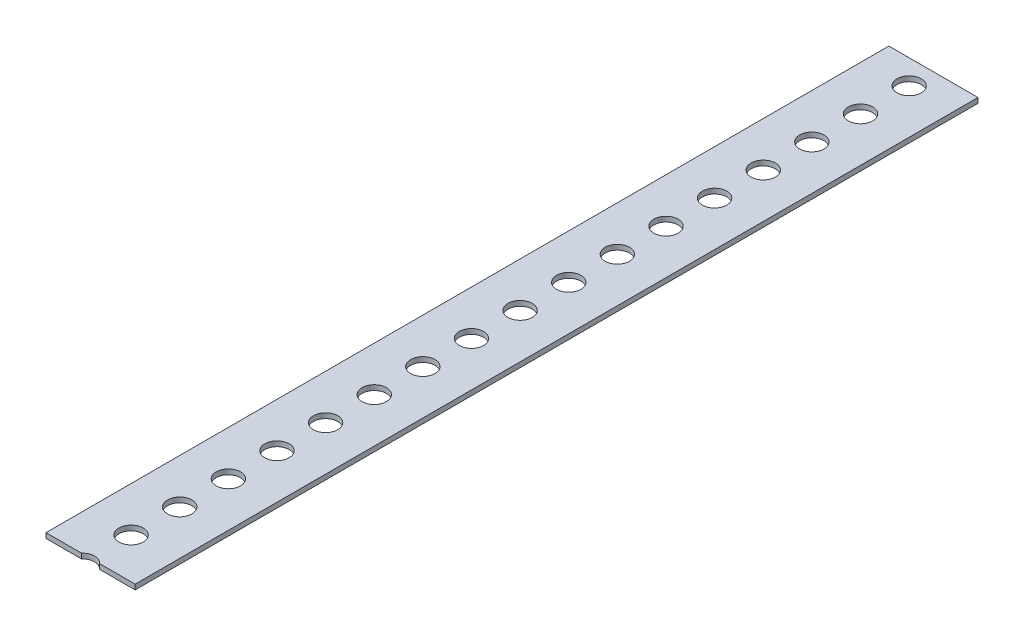
ISO-10303-21;
HEADER;
FILE_DESCRIPTION(('STEP AP214'),'2;1');
FILE_NAME('part.step','',(''),(''),'','','');
FILE_SCHEMA(('AUTOMOTIVE_DESIGN { 1 0 10303 214 1 1 1 1 }'));
ENDSEC;
DATA;
#1=APPLICATION_CONTEXT('core data for automotive mechanical design processes');
#2=APPLICATION_PROTOCOL_DEFINITION('international standard','automotive_design',2000,#1);
#3=PRODUCT_CONTEXT('',#1,'mechanical');
#4=PRODUCT('Part','Part','',(#3));
#5=PRODUCT_RELATED_PRODUCT_CATEGORY('part','',(#4));
#6=PRODUCT_DEFINITION_FORMATION('','',#4);
#7=PRODUCT_DEFINITION_CONTEXT('part definition',#1,'design');
#8=PRODUCT_DEFINITION('design','',#6,#7);
#9=PRODUCT_DEFINITION_SHAPE('','',#8);
#10=(LENGTH_UNIT() NAMED_UNIT(*) SI_UNIT(.MILLI.,.METRE.));
#11=(NAMED_UNIT(*) PLANE_ANGLE_UNIT() SI_UNIT($,.RADIAN.));
#12=(NAMED_UNIT(*) SI_UNIT($,.STERADIAN.) SOLID_ANGLE_UNIT());
#13=UNCERTAINTY_MEASURE_WITH_UNIT(LENGTH_MEASURE(1.E-05),#10,'distance_accuracy_value','');
#14=(GEOMETRIC_REPRESENTATION_CONTEXT(3) GLOBAL_UNCERTAINTY_ASSIGNED_CONTEXT((#13)) GLOBAL_UNIT_ASSIGNED_CONTEXT((#10,
#11,#12)) REPRESENTATION_CONTEXT('',''));
#15=CARTESIAN_POINT('',(0.,0.,0.));
#16=DIRECTION('',(0.,0.,1.));
#17=DIRECTION('',(1.,0.,0.));
#18=AXIS2_PLACEMENT_3D('',#15,#16,#17);
#19=CARTESIAN_POINT('',(-17.4624999999999,-0.99187,-457.199999999999));
#20=DIRECTION('',(-1.,0.,0.));
#21=DIRECTION('',(0.,0.,1.));
#22=AXIS2_PLACEMENT_3D('',#19,#20,#21);
#23=PLANE('',#22);
#24=DIRECTION('',(0.,-1.,0.));
#25=VECTOR('',#24,1.);
#26=CARTESIAN_POINT('',(-17.4625,-0.99187,-126.999999999999));
#27=LINE('',#26,#25);
#28=CARTESIAN_POINT('',(-17.4625,0.99187,-126.999999999999));
#29=VERTEX_POINT('',#28);
#30=CARTESIAN_POINT('',(-17.4625,-0.99187,-126.999999999999));
#31=VERTEX_POINT('',#30);
#32=EDGE_CURVE('E89',#29,#31,#27,.T.);
#33=ORIENTED_EDGE('',*,*,#32,.F.);
#34=DIRECTION('',(0.,0.,1.));
#35=VECTOR('',#34,1.);
#36=CARTESIAN_POINT('',(-17.4624999999999,0.99187,-457.199999999999));
#37=LINE('',#36,#35);
#38=CARTESIAN_POINT('',(-17.4624999999999,0.99187,-457.199999999999));
#39=VERTEX_POINT('',#38);
#40=EDGE_CURVE('E151',#39,#29,#37,.T.);
#41=ORIENTED_EDGE('',*,*,#40,.F.);
#42=DIRECTION('',(0.,1.,0.));
#43=VECTOR('',#42,1.);
#44=CARTESIAN_POINT('',(-17.4624999999999,-0.99187,-457.199999999999));
#45=LINE('',#44,#43);
#46=CARTESIAN_POINT('',(-17.4624999999999,-0.99187,-457.199999999999));
#47=VERTEX_POINT('',#46);
#48=EDGE_CURVE('E115',#47,#39,#45,.T.);
#49=ORIENTED_EDGE('',*,*,#48,.F.);
#50=DIRECTION('',(0.,0.,1.));
#51=VECTOR('',#50,1.);
#52=CARTESIAN_POINT('',(-17.4624999999999,-0.99187,-457.199999999999));
#53=LINE('',#52,#51);
#54=EDGE_CURVE('E107',#47,#31,#53,.T.);
#55=ORIENTED_EDGE('',*,*,#54,.T.);
#56=EDGE_LOOP('',(#33,#41,#49,#55));
#57=FACE_BOUND('',#56,.T.);
#58=ADVANCED_FACE('F39',(#57),#23,.T.);
#59=CARTESIAN_POINT('',(-17.4624999999999,-0.99187,-457.199999999999));
#60=DIRECTION('',(0.,0.,-1.));
#61=DIRECTION('',(-1.,0.,0.));
#62=AXIS2_PLACEMENT_3D('',#59,#60,#61);
#63=PLANE('',#62);
#64=ORIENTED_EDGE('',*,*,#48,.T.);
#65=DIRECTION('',(-1.,0.,0.));
#66=VECTOR('',#65,1.);
#67=CARTESIAN_POINT('',(-17.4624999999999,0.99187,-457.199999999999));
#68=LINE('',#67,#66);
#69=CARTESIAN_POINT('',(17.4624999999999,0.99187,-457.199999999999));
#70=VERTEX_POINT('',#69);
#71=EDGE_CURVE('E118',#70,#39,#68,.T.);
#72=ORIENTED_EDGE('',*,*,#71,.F.);
#73=DIRECTION('',(0.,1.,0.));
#74=VECTOR('',#73,1.);
#75=CARTESIAN_POINT('',(17.4624999999999,-0.99187,-457.199999999999));
#76=LINE('',#75,#74);
#77=CARTESIAN_POINT('',(17.4624999999999,-0.99187,-457.199999999999));
#78=VERTEX_POINT('',#77);
#79=EDGE_CURVE('E131',#78,#70,#76,.T.);
#80=ORIENTED_EDGE('',*,*,#79,.F.);
#81=DIRECTION('',(-1.,0.,0.));
#82=VECTOR('',#81,1.);
#83=CARTESIAN_POINT('',(-17.4624999999999,-0.99187,-457.199999999999));
#84=LINE('',#83,#82);
#85=EDGE_CURVE('E122',#78,#47,#84,.T.);
#86=ORIENTED_EDGE('',*,*,#85,.T.);
#87=EDGE_LOOP('',(#64,#72,#80,#86));
#88=FACE_BOUND('',#87,.T.);
#89=ADVANCED_FACE('F298',(#88),#63,.T.);
#90=CARTESIAN_POINT('',(17.4624999999999,-0.99187,-457.199999999999));
#91=DIRECTION('',(1.,0.,0.));
#92=DIRECTION('',(0.,0.,-1.));
#93=AXIS2_PLACEMENT_3D('',#90,#91,#92);
#94=PLANE('',#93);
#95=DIRECTION('',(0.,1.,0.));
#96=VECTOR('',#95,1.);
#97=CARTESIAN_POINT('',(17.4625,-0.99187,-126.999999999999));
#98=LINE('',#97,#96);
#99=CARTESIAN_POINT('',(17.4625,-0.99187,-126.999999999999));
#100=VERTEX_POINT('',#99);
#101=CARTESIAN_POINT('',(17.4625,0.99187,-126.999999999999));
#102=VERTEX_POINT('',#101);
#103=EDGE_CURVE('E113',#100,#102,#98,.T.);
#104=ORIENTED_EDGE('',*,*,#103,.F.);
#105=DIRECTION('',(0.,0.,-1.));
#106=VECTOR('',#105,1.);
#107=CARTESIAN_POINT('',(17.4624999999999,-0.99187,-457.199999999999));
#108=LINE('',#107,#106);
#109=EDGE_CURVE('E117',#100,#78,#108,.T.);
#110=ORIENTED_EDGE('',*,*,#109,.T.);
#111=ORIENTED_EDGE('',*,*,#79,.T.);
#112=DIRECTION('',(0.,0.,-1.));
#113=VECTOR('',#112,1.);
#114=CARTESIAN_POINT('',(17.4624999999999,0.99187,-457.199999999999));
#115=LINE('',#114,#113);
#116=EDGE_CURVE('E125',#102,#70,#115,.T.);
#117=ORIENTED_EDGE('',*,*,#116,.F.);
#118=EDGE_LOOP('',(#104,#110,#111,#117));
#119=FACE_BOUND('',#118,.T.);
#120=ADVANCED_FACE('F296',(#119),#94,.T.);
#121=CARTESIAN_POINT('',(0.,-0.99187,0.));
#122=DIRECTION('',(0.,1.,0.));
#123=DIRECTION('',(0.,0.,1.));
#124=AXIS2_PLACEMENT_3D('',#121,#122,#123);
#125=PLANE('',#124);
#126=ORIENTED_EDGE('',*,*,#109,.F.);
#127=DIRECTION('',(1.,0.,0.));
#128=VECTOR('',#127,1.);
#129=CARTESIAN_POINT('',(-17.4625,-0.99187,-126.999999999999));
#130=LINE('',#129,#128);
#131=CARTESIAN_POINT('',(3.54975791428115,-0.99187,-126.999999999999));
#132=VERTEX_POINT('',#131);
#133=EDGE_CURVE('E98',#132,#100,#130,.T.);
#134=ORIENTED_EDGE('',*,*,#133,.F.);
#135=CARTESIAN_POINT('',(0.,-0.99187,-123.824999999999));
#136=DIRECTION('',(0.,1.,0.));
#137=DIRECTION('',(0.,0.,1.));
#138=AXIS2_PLACEMENT_3D('',#135,#136,#137);
#139=CIRCLE('',#138,4.76250000000013);
#140=CARTESIAN_POINT('',(-3.54975791428115,-0.99187,-126.999999999999));
#141=VERTEX_POINT('',#140);
#142=EDGE_CURVE('E111',#141,#132,#139,.F.);
#143=ORIENTED_EDGE('',*,*,#142,.F.);
#144=EDGE_CURVE('E54',#31,#141,#130,.T.);
#145=ORIENTED_EDGE('',*,*,#144,.F.);
#146=ORIENTED_EDGE('',*,*,#54,.F.);
#147=ORIENTED_EDGE('',*,*,#85,.F.);
#148=EDGE_LOOP('',(#126,#134,#143,#145,#146,#147));
#149=FACE_BOUND('',#148,.T.);
#150=CARTESIAN_POINT('',(0.,-0.99187,-142.874999999999));
#151=DIRECTION('',(0.,1.,0.));
#152=DIRECTION('',(0.,0.,1.));
#153=AXIS2_PLACEMENT_3D('',#150,#151,#152);
#154=CIRCLE('',#153,4.76250000000013);
#155=CARTESIAN_POINT('',(0.,-0.99187,-138.112499999999));
#156=VERTEX_POINT('',#155);
#157=EDGE_CURVE('E147',#156,#156,#154,.F.);
#158=ORIENTED_EDGE('',*,*,#157,.F.);
#159=EDGE_LOOP('',(#158));
#160=FACE_BOUND('',#159,.T.);
#161=CARTESIAN_POINT('',(0.,-0.99187,-161.924999999999));
#162=DIRECTION('',(0.,1.,0.));
#163=DIRECTION('',(0.,0.,1.));
#164=AXIS2_PLACEMENT_3D('',#161,#162,#163);
#165=CIRCLE('',#164,4.76250000000013);
#166=CARTESIAN_POINT('',(0.,-0.99187,-157.162499999999));
#167=VERTEX_POINT('',#166);
#168=EDGE_CURVE('E161',#167,#167,#165,.F.);
#169=ORIENTED_EDGE('',*,*,#168,.F.);
#170=EDGE_LOOP('',(#169));
#171=FACE_BOUND('',#170,.T.);
#172=CARTESIAN_POINT('',(0.,-0.99187,-180.974999999999));
#173=DIRECTION('',(0.,1.,0.));
#174=DIRECTION('',(0.,0.,1.));
#175=AXIS2_PLACEMENT_3D('',#172,#173,#174);
#176=CIRCLE('',#175,4.76250000000013);
#177=CARTESIAN_POINT('',(0.,-0.99187,-176.212499999999));
#178=VERTEX_POINT('',#177);
#179=EDGE_CURVE('E167',#178,#178,#176,.F.);
#180=ORIENTED_EDGE('',*,*,#179,.F.);
#181=EDGE_LOOP('',(#180));
#182=FACE_BOUND('',#181,.T.);
#183=CARTESIAN_POINT('',(0.,-0.99187,-200.024999999999));
#184=DIRECTION('',(0.,1.,0.));
#185=DIRECTION('',(0.,0.,1.));
#186=AXIS2_PLACEMENT_3D('',#183,#184,#185);
#187=CIRCLE('',#186,4.76250000000013);
#188=CARTESIAN_POINT('',(0.,-0.99187,-195.262499999999));
#189=VERTEX_POINT('',#188);
#190=EDGE_CURVE('E175',#189,#189,#187,.F.);
#191=ORIENTED_EDGE('',*,*,#190,.F.);
#192=EDGE_LOOP('',(#191));
#193=FACE_BOUND('',#192,.T.);
#194=CARTESIAN_POINT('',(0.,-0.99187,-219.074999999999));
#195=DIRECTION('',(0.,1.,0.));
#196=DIRECTION('',(0.,0.,1.));
#197=AXIS2_PLACEMENT_3D('',#194,#195,#196);
#198=CIRCLE('',#197,4.76250000000013);
#199=CARTESIAN_POINT('',(0.,-0.99187,-214.312499999999));
#200=VERTEX_POINT('',#199);
#201=EDGE_CURVE('E183',#200,#200,#198,.F.);
#202=ORIENTED_EDGE('',*,*,#201,.F.);
#203=EDGE_LOOP('',(#202));
#204=FACE_BOUND('',#203,.T.);
#205=CARTESIAN_POINT('',(0.,-0.99187,-238.124999999999));
#206=DIRECTION('',(0.,1.,0.));
#207=DIRECTION('',(0.,0.,1.));
#208=AXIS2_PLACEMENT_3D('',#205,#206,#207);
#209=CIRCLE('',#208,4.76250000000013);
#210=CARTESIAN_POINT('',(0.,-0.99187,-233.362499999999));
#211=VERTEX_POINT('',#210);
#212=EDGE_CURVE('E191',#211,#211,#209,.F.);
#213=ORIENTED_EDGE('',*,*,#212,.F.);
#214=EDGE_LOOP('',(#213));
#215=FACE_BOUND('',#214,.T.);
#216=CARTESIAN_POINT('',(0.,-0.99187,-257.174999999999));
#217=DIRECTION('',(0.,1.,0.));
#218=DIRECTION('',(0.,0.,1.));
#219=AXIS2_PLACEMENT_3D('',#216,#217,#218);
#220=CIRCLE('',#219,4.76250000000013);
#221=CARTESIAN_POINT('',(0.,-0.99187,-252.412499999999));
#222=VERTEX_POINT('',#221);
#223=EDGE_CURVE('E199',#222,#222,#220,.F.);
#224=ORIENTED_EDGE('',*,*,#223,.F.);
#225=EDGE_LOOP('',(#224));
#226=FACE_BOUND('',#225,.T.);
#227=CARTESIAN_POINT('',(0.,-0.99187,-276.224999999999));
#228=DIRECTION('',(0.,1.,0.));
#229=DIRECTION('',(0.,0.,1.));
#230=AXIS2_PLACEMENT_3D('',#227,#228,#229);
#231=CIRCLE('',#230,4.76250000000013);
#232=CARTESIAN_POINT('',(0.,-0.99187,-271.462499999999));
#233=VERTEX_POINT('',#232);
#234=EDGE_CURVE('E207',#233,#233,#231,.F.);
#235=ORIENTED_EDGE('',*,*,#234,.F.);
#236=EDGE_LOOP('',(#235));
#237=FACE_BOUND('',#236,.T.);
#238=CARTESIAN_POINT('',(0.,-0.99187,-295.274999999999));
#239=DIRECTION('',(0.,1.,0.));
#240=DIRECTION('',(0.,0.,1.));
#241=AXIS2_PLACEMENT_3D('',#238,#239,#240);
#242=CIRCLE('',#241,4.76250000000013);
#243=CARTESIAN_POINT('',(0.,-0.99187,-290.512499999999));
#244=VERTEX_POINT('',#243);
#245=EDGE_CURVE('E215',#244,#244,#242,.F.);
#246=ORIENTED_EDGE('',*,*,#245,.F.);
#247=EDGE_LOOP('',(#246));
#248=FACE_BOUND('',#247,.T.);
#249=CARTESIAN_POINT('',(0.,-0.99187,-314.324999999999));
#250=DIRECTION('',(0.,1.,0.));
#251=DIRECTION('',(0.,0.,1.));
#252=AXIS2_PLACEMENT_3D('',#249,#250,#251);
#253=CIRCLE('',#252,4.76250000000013);
#254=CARTESIAN_POINT('',(0.,-0.99187,-309.562499999999));
#255=VERTEX_POINT('',#254);
#256=EDGE_CURVE('E223',#255,#255,#253,.F.);
#257=ORIENTED_EDGE('',*,*,#256,.F.);
#258=EDGE_LOOP('',(#257));
#259=FACE_BOUND('',#258,.T.);
#260=CARTESIAN_POINT('',(0.,-0.99187,-333.374999999999));
#261=DIRECTION('',(0.,1.,0.));
#262=DIRECTION('',(0.,0.,1.));
#263=AXIS2_PLACEMENT_3D('',#260,#261,#262);
#264=CIRCLE('',#263,4.76250000000013);
#265=CARTESIAN_POINT('',(0.,-0.99187,-328.612499999999));
#266=VERTEX_POINT('',#265);
#267=EDGE_CURVE('E231',#266,#266,#264,.F.);
#268=ORIENTED_EDGE('',*,*,#267,.F.);
#269=EDGE_LOOP('',(#268));
#270=FACE_BOUND('',#269,.T.);
#271=CARTESIAN_POINT('',(0.,-0.99187,-352.424999999999));
#272=DIRECTION('',(0.,1.,0.));
#273=DIRECTION('',(0.,0.,1.));
#274=AXIS2_PLACEMENT_3D('',#271,#272,#273);
#275=CIRCLE('',#274,4.76250000000013);
#276=CARTESIAN_POINT('',(0.,-0.99187,-347.662499999999));
#277=VERTEX_POINT('',#276);
#278=EDGE_CURVE('E239',#277,#277,#275,.F.);
#279=ORIENTED_EDGE('',*,*,#278,.F.);
#280=EDGE_LOOP('',(#279));
#281=FACE_BOUND('',#280,.T.);
#282=CARTESIAN_POINT('',(0.,-0.99187,-371.474999999999));
#283=DIRECTION('',(0.,1.,0.));
#284=DIRECTION('',(0.,0.,1.));
#285=AXIS2_PLACEMENT_3D('',#282,#283,#284);
#286=CIRCLE('',#285,4.76250000000013);
#287=CARTESIAN_POINT('',(0.,-0.99187,-366.712499999999));
#288=VERTEX_POINT('',#287);
#289=EDGE_CURVE('E247',#288,#288,#286,.F.);
#290=ORIENTED_EDGE('',*,*,#289,.F.);
#291=EDGE_LOOP('',(#290));
#292=FACE_BOUND('',#291,.T.);
#293=CARTESIAN_POINT('',(0.,-0.99187,-390.524999999999));
#294=DIRECTION('',(0.,1.,0.));
#295=DIRECTION('',(0.,0.,1.));
#296=AXIS2_PLACEMENT_3D('',#293,#294,#295);
#297=CIRCLE('',#296,4.76250000000013);
#298=CARTESIAN_POINT('',(0.,-0.99187,-385.762499999999));
#299=VERTEX_POINT('',#298);
#300=EDGE_CURVE('E255',#299,#299,#297,.F.);
#301=ORIENTED_EDGE('',*,*,#300,.F.);
#302=EDGE_LOOP('',(#301));
#303=FACE_BOUND('',#302,.T.);
#304=CARTESIAN_POINT('',(0.,-0.99187,-409.574999999999));
#305=DIRECTION('',(0.,1.,0.));
#306=DIRECTION('',(0.,0.,1.));
#307=AXIS2_PLACEMENT_3D('',#304,#305,#306);
#308=CIRCLE('',#307,4.76250000000013);
#309=CARTESIAN_POINT('',(0.,-0.99187,-404.812499999999));
#310=VERTEX_POINT('',#309);
#311=EDGE_CURVE('E263',#310,#310,#308,.F.);
#312=ORIENTED_EDGE('',*,*,#311,.F.);
#313=EDGE_LOOP('',(#312));
#314=FACE_BOUND('',#313,.T.);
#315=CARTESIAN_POINT('',(0.,-0.99187,-428.624999999999));
#316=DIRECTION('',(0.,1.,0.));
#317=DIRECTION('',(0.,0.,1.));
#318=AXIS2_PLACEMENT_3D('',#315,#316,#317);
#319=CIRCLE('',#318,4.76250000000013);
#320=CARTESIAN_POINT('',(0.,-0.99187,-423.862499999999));
#321=VERTEX_POINT('',#320);
#322=EDGE_CURVE('E271',#321,#321,#319,.F.);
#323=ORIENTED_EDGE('',*,*,#322,.F.);
#324=EDGE_LOOP('',(#323));
#325=FACE_BOUND('',#324,.T.);
#326=CARTESIAN_POINT('',(0.,-0.99187,-447.674999999999));
#327=DIRECTION('',(0.,1.,0.));
#328=DIRECTION('',(0.,0.,1.));
#329=AXIS2_PLACEMENT_3D('',#326,#327,#328);
#330=CIRCLE('',#329,4.76250000000013);
#331=CARTESIAN_POINT('',(0.,-0.99187,-442.912499999999));
#332=VERTEX_POINT('',#331);
#333=EDGE_CURVE('E279',#332,#332,#330,.F.);
#334=ORIENTED_EDGE('',*,*,#333,.F.);
#335=EDGE_LOOP('',(#334));
#336=FACE_BOUND('',#335,.T.);
#337=ADVANCED_FACE('F104',(#149,#160,#171,#182,#193,#204,#215,#226,#237,#248,#259,#270,#281,
#292,#303,#314,#325,#336),#125,.F.);
#338=CARTESIAN_POINT('',(0.,0.99187,0.));
#339=DIRECTION('',(0.,1.,0.));
#340=DIRECTION('',(0.,0.,1.));
#341=AXIS2_PLACEMENT_3D('',#338,#339,#340);
#342=PLANE('',#341);
#343=DIRECTION('',(-1.,0.,0.));
#344=VECTOR('',#343,1.);
#345=CARTESIAN_POINT('',(-17.4625,0.99187,-126.999999999999));
#346=LINE('',#345,#344);
#347=CARTESIAN_POINT('',(3.54975791428115,0.99187,-126.999999999999));
#348=VERTEX_POINT('',#347);
#349=EDGE_CURVE('E61',#102,#348,#346,.T.);
#350=ORIENTED_EDGE('',*,*,#349,.F.);
#351=ORIENTED_EDGE('',*,*,#116,.T.);
#352=ORIENTED_EDGE('',*,*,#71,.T.);
#353=ORIENTED_EDGE('',*,*,#40,.T.);
#354=CARTESIAN_POINT('',(-3.54975791428115,0.99187,-126.999999999999));
#355=VERTEX_POINT('',#354);
#356=EDGE_CURVE('E92',#355,#29,#346,.T.);
#357=ORIENTED_EDGE('',*,*,#356,.F.);
#358=CARTESIAN_POINT('',(0.,0.99187,-123.824999999999));
#359=DIRECTION('',(0.,1.,0.));
#360=DIRECTION('',(0.,0.,1.));
#361=AXIS2_PLACEMENT_3D('',#358,#359,#360);
#362=CIRCLE('',#361,4.76250000000013);
#363=EDGE_CURVE('E141',#348,#355,#362,.T.);
#364=ORIENTED_EDGE('',*,*,#363,.F.);
#365=EDGE_LOOP('',(#350,#351,#352,#353,#357,#364));
#366=FACE_BOUND('',#365,.T.);
#367=CARTESIAN_POINT('',(0.,0.99187,-142.874999999999));
#368=DIRECTION('',(0.,1.,0.));
#369=DIRECTION('',(0.,0.,1.));
#370=AXIS2_PLACEMENT_3D('',#367,#368,#369);
#371=CIRCLE('',#370,4.76250000000013);
#372=CARTESIAN_POINT('',(0.,0.99187,-138.112499999999));
#373=VERTEX_POINT('',#372);
#374=EDGE_CURVE('E154',#373,#373,#371,.T.);
#375=ORIENTED_EDGE('',*,*,#374,.F.);
#376=EDGE_LOOP('',(#375));
#377=FACE_BOUND('',#376,.T.);
#378=CARTESIAN_POINT('',(0.,0.99187,-161.924999999999));
#379=DIRECTION('',(0.,1.,0.));
#380=DIRECTION('',(0.,0.,1.));
#381=AXIS2_PLACEMENT_3D('',#378,#379,#380);
#382=CIRCLE('',#381,4.76250000000013);
#383=CARTESIAN_POINT('',(0.,0.99187,-157.162499999999));
#384=VERTEX_POINT('',#383);
#385=EDGE_CURVE('E163',#384,#384,#382,.T.);
#386=ORIENTED_EDGE('',*,*,#385,.F.);
#387=EDGE_LOOP('',(#386));
#388=FACE_BOUND('',#387,.T.);
#389=CARTESIAN_POINT('',(0.,0.99187,-180.974999999999));
#390=DIRECTION('',(0.,1.,0.));
#391=DIRECTION('',(0.,0.,1.));
#392=AXIS2_PLACEMENT_3D('',#389,#390,#391);
#393=CIRCLE('',#392,4.76250000000013);
#394=CARTESIAN_POINT('',(0.,0.99187,-176.212499999999));
#395=VERTEX_POINT('',#394);
#396=EDGE_CURVE('E171',#395,#395,#393,.T.);
#397=ORIENTED_EDGE('',*,*,#396,.F.);
#398=EDGE_LOOP('',(#397));
#399=FACE_BOUND('',#398,.T.);
#400=CARTESIAN_POINT('',(0.,0.99187,-200.024999999999));
#401=DIRECTION('',(0.,1.,0.));
#402=DIRECTION('',(0.,0.,1.));
#403=AXIS2_PLACEMENT_3D('',#400,#401,#402);
#404=CIRCLE('',#403,4.76250000000013);
#405=CARTESIAN_POINT('',(0.,0.99187,-195.262499999999));
#406=VERTEX_POINT('',#405);
#407=EDGE_CURVE('E179',#406,#406,#404,.T.);
#408=ORIENTED_EDGE('',*,*,#407,.F.);
#409=EDGE_LOOP('',(#408));
#410=FACE_BOUND('',#409,.T.);
#411=CARTESIAN_POINT('',(0.,0.99187,-219.074999999999));
#412=DIRECTION('',(0.,1.,0.));
#413=DIRECTION('',(0.,0.,1.));
#414=AXIS2_PLACEMENT_3D('',#411,#412,#413);
#415=CIRCLE('',#414,4.76250000000013);
#416=CARTESIAN_POINT('',(0.,0.99187,-214.312499999999));
#417=VERTEX_POINT('',#416);
#418=EDGE_CURVE('E187',#417,#417,#415,.T.);
#419=ORIENTED_EDGE('',*,*,#418,.F.);
#420=EDGE_LOOP('',(#419));
#421=FACE_BOUND('',#420,.T.);
#422=CARTESIAN_POINT('',(0.,0.99187,-238.124999999999));
#423=DIRECTION('',(0.,1.,0.));
#424=DIRECTION('',(0.,0.,1.));
#425=AXIS2_PLACEMENT_3D('',#422,#423,#424);
#426=CIRCLE('',#425,4.76250000000013);
#427=CARTESIAN_POINT('',(0.,0.99187,-233.362499999999));
#428=VERTEX_POINT('',#427);
#429=EDGE_CURVE('E195',#428,#428,#426,.T.);
#430=ORIENTED_EDGE('',*,*,#429,.F.);
#431=EDGE_LOOP('',(#430));
#432=FACE_BOUND('',#431,.T.);
#433=CARTESIAN_POINT('',(0.,0.99187,-257.174999999999));
#434=DIRECTION('',(0.,1.,0.));
#435=DIRECTION('',(0.,0.,1.));
#436=AXIS2_PLACEMENT_3D('',#433,#434,#435);
#437=CIRCLE('',#436,4.76250000000013);
#438=CARTESIAN_POINT('',(0.,0.99187,-252.412499999999));
#439=VERTEX_POINT('',#438);
#440=EDGE_CURVE('E203',#439,#439,#437,.T.);
#441=ORIENTED_EDGE('',*,*,#440,.F.);
#442=EDGE_LOOP('',(#441));
#443=FACE_BOUND('',#442,.T.);
#444=CARTESIAN_POINT('',(0.,0.99187,-276.224999999999));
#445=DIRECTION('',(0.,1.,0.));
#446=DIRECTION('',(0.,0.,1.));
#447=AXIS2_PLACEMENT_3D('',#444,#445,#446);
#448=CIRCLE('',#447,4.76250000000013);
#449=CARTESIAN_POINT('',(0.,0.99187,-271.462499999999));
#450=VERTEX_POINT('',#449);
#451=EDGE_CURVE('E211',#450,#450,#448,.T.);
#452=ORIENTED_EDGE('',*,*,#451,.F.);
#453=EDGE_LOOP('',(#452));
#454=FACE_BOUND('',#453,.T.);
#455=CARTESIAN_POINT('',(0.,0.99187,-295.274999999999));
#456=DIRECTION('',(0.,1.,0.));
#457=DIRECTION('',(0.,0.,1.));
#458=AXIS2_PLACEMENT_3D('',#455,#456,#457);
#459=CIRCLE('',#458,4.76250000000013);
#460=CARTESIAN_POINT('',(0.,0.99187,-290.512499999999));
#461=VERTEX_POINT('',#460);
#462=EDGE_CURVE('E219',#461,#461,#459,.T.);
#463=ORIENTED_EDGE('',*,*,#462,.F.);
#464=EDGE_LOOP('',(#463));
#465=FACE_BOUND('',#464,.T.);
#466=CARTESIAN_POINT('',(0.,0.99187,-314.324999999999));
#467=DIRECTION('',(0.,1.,0.));
#468=DIRECTION('',(0.,0.,1.));
#469=AXIS2_PLACEMENT_3D('',#466,#467,#468);
#470=CIRCLE('',#469,4.76250000000013);
#471=CARTESIAN_POINT('',(0.,0.99187,-309.562499999999));
#472=VERTEX_POINT('',#471);
#473=EDGE_CURVE('E227',#472,#472,#470,.T.);
#474=ORIENTED_EDGE('',*,*,#473,.F.);
#475=EDGE_LOOP('',(#474));
#476=FACE_BOUND('',#475,.T.);
#477=CARTESIAN_POINT('',(0.,0.99187,-333.374999999999));
#478=DIRECTION('',(0.,1.,0.));
#479=DIRECTION('',(0.,0.,1.));
#480=AXIS2_PLACEMENT_3D('',#477,#478,#479);
#481=CIRCLE('',#480,4.76250000000013);
#482=CARTESIAN_POINT('',(0.,0.99187,-328.612499999999));
#483=VERTEX_POINT('',#482);
#484=EDGE_CURVE('E235',#483,#483,#481,.T.);
#485=ORIENTED_EDGE('',*,*,#484,.F.);
#486=EDGE_LOOP('',(#485));
#487=FACE_BOUND('',#486,.T.);
#488=CARTESIAN_POINT('',(0.,0.99187,-352.424999999999));
#489=DIRECTION('',(0.,1.,0.));
#490=DIRECTION('',(0.,0.,1.));
#491=AXIS2_PLACEMENT_3D('',#488,#489,#490);
#492=CIRCLE('',#491,4.76250000000013);
#493=CARTESIAN_POINT('',(0.,0.99187,-347.662499999999));
#494=VERTEX_POINT('',#493);
#495=EDGE_CURVE('E243',#494,#494,#492,.T.);
#496=ORIENTED_EDGE('',*,*,#495,.F.);
#497=EDGE_LOOP('',(#496));
#498=FACE_BOUND('',#497,.T.);
#499=CARTESIAN_POINT('',(0.,0.99187,-371.474999999999));
#500=DIRECTION('',(0.,1.,0.));
#501=DIRECTION('',(0.,0.,1.));
#502=AXIS2_PLACEMENT_3D('',#499,#500,#501);
#503=CIRCLE('',#502,4.76250000000013);
#504=CARTESIAN_POINT('',(0.,0.99187,-366.712499999999));
#505=VERTEX_POINT('',#504);
#506=EDGE_CURVE('E251',#505,#505,#503,.T.);
#507=ORIENTED_EDGE('',*,*,#506,.F.);
#508=EDGE_LOOP('',(#507));
#509=FACE_BOUND('',#508,.T.);
#510=CARTESIAN_POINT('',(0.,0.99187,-390.524999999999));
#511=DIRECTION('',(0.,1.,0.));
#512=DIRECTION('',(0.,0.,1.));
#513=AXIS2_PLACEMENT_3D('',#510,#511,#512);
#514=CIRCLE('',#513,4.76250000000013);
#515=CARTESIAN_POINT('',(0.,0.99187,-385.762499999999));
#516=VERTEX_POINT('',#515);
#517=EDGE_CURVE('E259',#516,#516,#514,.T.);
#518=ORIENTED_EDGE('',*,*,#517,.F.);
#519=EDGE_LOOP('',(#518));
#520=FACE_BOUND('',#519,.T.);
#521=CARTESIAN_POINT('',(0.,0.99187,-409.574999999999));
#522=DIRECTION('',(0.,1.,0.));
#523=DIRECTION('',(0.,0.,1.));
#524=AXIS2_PLACEMENT_3D('',#521,#522,#523);
#525=CIRCLE('',#524,4.76250000000013);
#526=CARTESIAN_POINT('',(0.,0.99187,-404.812499999999));
#527=VERTEX_POINT('',#526);
#528=EDGE_CURVE('E267',#527,#527,#525,.T.);
#529=ORIENTED_EDGE('',*,*,#528,.F.);
#530=EDGE_LOOP('',(#529));
#531=FACE_BOUND('',#530,.T.);
#532=CARTESIAN_POINT('',(0.,0.99187,-428.624999999999));
#533=DIRECTION('',(0.,1.,0.));
#534=DIRECTION('',(0.,0.,1.));
#535=AXIS2_PLACEMENT_3D('',#532,#533,#534);
#536=CIRCLE('',#535,4.76250000000013);
#537=CARTESIAN_POINT('',(0.,0.99187,-423.862499999999));
#538=VERTEX_POINT('',#537);
#539=EDGE_CURVE('E275',#538,#538,#536,.T.);
#540=ORIENTED_EDGE('',*,*,#539,.F.);
#541=EDGE_LOOP('',(#540));
#542=FACE_BOUND('',#541,.T.);
#543=CARTESIAN_POINT('',(0.,0.99187,-447.674999999999));
#544=DIRECTION('',(0.,1.,0.));
#545=DIRECTION('',(0.,0.,1.));
#546=AXIS2_PLACEMENT_3D('',#543,#544,#545);
#547=CIRCLE('',#546,4.76250000000013);
#548=CARTESIAN_POINT('',(0.,0.99187,-442.912499999999));
#549=VERTEX_POINT('',#548);
#550=EDGE_CURVE('E283',#549,#549,#547,.T.);
#551=ORIENTED_EDGE('',*,*,#550,.F.);
#552=EDGE_LOOP('',(#551));
#553=FACE_BOUND('',#552,.T.);
#554=ADVANCED_FACE('F143',(#366,#377,#388,#399,#410,#421,#432,#443,#454,#465,#476,#487,#498,
#509,#520,#531,#542,#553),#342,.T.);
#555=CARTESIAN_POINT('',(0.,-0.99287,-447.674999999999));
#556=DIRECTION('',(0.,1.,0.));
#557=DIRECTION('',(0.,0.,1.));
#558=AXIS2_PLACEMENT_3D('',#555,#556,#557);
#559=CYLINDRICAL_SURFACE('',#558,4.76250000000013);
#560=ORIENTED_EDGE('',*,*,#550,.T.);
#561=EDGE_LOOP('',(#560));
#562=FACE_BOUND('',#561,.T.);
#563=ORIENTED_EDGE('',*,*,#333,.T.);
#564=EDGE_LOOP('',(#563));
#565=FACE_BOUND('',#564,.T.);
#566=ADVANCED_FACE('F328',(#562,#565),#559,.F.);
#567=CARTESIAN_POINT('',(0.,-0.99287,-428.624999999999));
#568=DIRECTION('',(0.,1.,0.));
#569=DIRECTION('',(0.,0.,1.));
#570=AXIS2_PLACEMENT_3D('',#567,#568,#569);
#571=CYLINDRICAL_SURFACE('',#570,4.76250000000013);
#572=ORIENTED_EDGE('',*,*,#539,.T.);
#573=EDGE_LOOP('',(#572));
#574=FACE_BOUND('',#573,.T.);
#575=ORIENTED_EDGE('',*,*,#322,.T.);
#576=EDGE_LOOP('',(#575));
#577=FACE_BOUND('',#576,.T.);
#578=ADVANCED_FACE('F331',(#574,#577),#571,.F.);
#579=CARTESIAN_POINT('',(0.,-0.99287,-409.574999999999));
#580=DIRECTION('',(0.,1.,0.));
#581=DIRECTION('',(0.,0.,1.));
#582=AXIS2_PLACEMENT_3D('',#579,#580,#581);
#583=CYLINDRICAL_SURFACE('',#582,4.76250000000013);
#584=ORIENTED_EDGE('',*,*,#528,.T.);
#585=EDGE_LOOP('',(#584));
#586=FACE_BOUND('',#585,.T.);
#587=ORIENTED_EDGE('',*,*,#311,.T.);
#588=EDGE_LOOP('',(#587));
#589=FACE_BOUND('',#588,.T.);
#590=ADVANCED_FACE('F335',(#586,#589),#583,.F.);
#591=CARTESIAN_POINT('',(0.,-0.99287,-390.524999999999));
#592=DIRECTION('',(0.,1.,0.));
#593=DIRECTION('',(0.,0.,1.));
#594=AXIS2_PLACEMENT_3D('',#591,#592,#593);
#595=CYLINDRICAL_SURFACE('',#594,4.76250000000013);
#596=ORIENTED_EDGE('',*,*,#517,.T.);
#597=EDGE_LOOP('',(#596));
#598=FACE_BOUND('',#597,.T.);
#599=ORIENTED_EDGE('',*,*,#300,.T.);
#600=EDGE_LOOP('',(#599));
#601=FACE_BOUND('',#600,.T.);
#602=ADVANCED_FACE('F339',(#598,#601),#595,.F.);
#603=CARTESIAN_POINT('',(0.,-0.99287,-371.474999999999));
#604=DIRECTION('',(0.,1.,0.));
#605=DIRECTION('',(0.,0.,1.));
#606=AXIS2_PLACEMENT_3D('',#603,#604,#605);
#607=CYLINDRICAL_SURFACE('',#606,4.76250000000013);
#608=ORIENTED_EDGE('',*,*,#506,.T.);
#609=EDGE_LOOP('',(#608));
#610=FACE_BOUND('',#609,.T.);
#611=ORIENTED_EDGE('',*,*,#289,.T.);
#612=EDGE_LOOP('',(#611));
#613=FACE_BOUND('',#612,.T.);
#614=ADVANCED_FACE('F343',(#610,#613),#607,.F.);
#615=CARTESIAN_POINT('',(0.,-0.99287,-352.424999999999));
#616=DIRECTION('',(0.,1.,0.));
#617=DIRECTION('',(0.,0.,1.));
#618=AXIS2_PLACEMENT_3D('',#615,#616,#617);
#619=CYLINDRICAL_SURFACE('',#618,4.76250000000013);
#620=ORIENTED_EDGE('',*,*,#495,.T.);
#621=EDGE_LOOP('',(#620));
#622=FACE_BOUND('',#621,.T.);
#623=ORIENTED_EDGE('',*,*,#278,.T.);
#624=EDGE_LOOP('',(#623));
#625=FACE_BOUND('',#624,.T.);
#626=ADVANCED_FACE('F347',(#622,#625),#619,.F.);
#627=CARTESIAN_POINT('',(0.,-0.99287,-333.374999999999));
#628=DIRECTION('',(0.,1.,0.));
#629=DIRECTION('',(0.,0.,1.));
#630=AXIS2_PLACEMENT_3D('',#627,#628,#629);
#631=CYLINDRICAL_SURFACE('',#630,4.76250000000013);
#632=ORIENTED_EDGE('',*,*,#484,.T.);
#633=EDGE_LOOP('',(#632));
#634=FACE_BOUND('',#633,.T.);
#635=ORIENTED_EDGE('',*,*,#267,.T.);
#636=EDGE_LOOP('',(#635));
#637=FACE_BOUND('',#636,.T.);
#638=ADVANCED_FACE('F351',(#634,#637),#631,.F.);
#639=CARTESIAN_POINT('',(0.,-0.99287,-314.324999999999));
#640=DIRECTION('',(0.,1.,0.));
#641=DIRECTION('',(0.,0.,1.));
#642=AXIS2_PLACEMENT_3D('',#639,#640,#641);
#643=CYLINDRICAL_SURFACE('',#642,4.76250000000013);
#644=ORIENTED_EDGE('',*,*,#473,.T.);
#645=EDGE_LOOP('',(#644));
#646=FACE_BOUND('',#645,.T.);
#647=ORIENTED_EDGE('',*,*,#256,.T.);
#648=EDGE_LOOP('',(#647));
#649=FACE_BOUND('',#648,.T.);
#650=ADVANCED_FACE('F355',(#646,#649),#643,.F.);
#651=CARTESIAN_POINT('',(0.,-0.99287,-295.274999999999));
#652=DIRECTION('',(0.,1.,0.));
#653=DIRECTION('',(0.,0.,1.));
#654=AXIS2_PLACEMENT_3D('',#651,#652,#653);
#655=CYLINDRICAL_SURFACE('',#654,4.76250000000013);
#656=ORIENTED_EDGE('',*,*,#462,.T.);
#657=EDGE_LOOP('',(#656));
#658=FACE_BOUND('',#657,.T.);
#659=ORIENTED_EDGE('',*,*,#245,.T.);
#660=EDGE_LOOP('',(#659));
#661=FACE_BOUND('',#660,.T.);
#662=ADVANCED_FACE('F359',(#658,#661),#655,.F.);
#663=CARTESIAN_POINT('',(0.,-0.99287,-276.224999999999));
#664=DIRECTION('',(0.,1.,0.));
#665=DIRECTION('',(0.,0.,1.));
#666=AXIS2_PLACEMENT_3D('',#663,#664,#665);
#667=CYLINDRICAL_SURFACE('',#666,4.76250000000013);
#668=ORIENTED_EDGE('',*,*,#451,.T.);
#669=EDGE_LOOP('',(#668));
#670=FACE_BOUND('',#669,.T.);
#671=ORIENTED_EDGE('',*,*,#234,.T.);
#672=EDGE_LOOP('',(#671));
#673=FACE_BOUND('',#672,.T.);
#674=ADVANCED_FACE('F363',(#670,#673),#667,.F.);
#675=CARTESIAN_POINT('',(0.,-0.99287,-257.174999999999));
#676=DIRECTION('',(0.,1.,0.));
#677=DIRECTION('',(0.,0.,1.));
#678=AXIS2_PLACEMENT_3D('',#675,#676,#677);
#679=CYLINDRICAL_SURFACE('',#678,4.76250000000013);
#680=ORIENTED_EDGE('',*,*,#440,.T.);
#681=EDGE_LOOP('',(#680));
#682=FACE_BOUND('',#681,.T.);
#683=ORIENTED_EDGE('',*,*,#223,.T.);
#684=EDGE_LOOP('',(#683));
#685=FACE_BOUND('',#684,.T.);
#686=ADVANCED_FACE('F367',(#682,#685),#679,.F.);
#687=CARTESIAN_POINT('',(0.,-0.99287,-238.124999999999));
#688=DIRECTION('',(0.,1.,0.));
#689=DIRECTION('',(0.,0.,1.));
#690=AXIS2_PLACEMENT_3D('',#687,#688,#689);
#691=CYLINDRICAL_SURFACE('',#690,4.76250000000013);
#692=ORIENTED_EDGE('',*,*,#429,.T.);
#693=EDGE_LOOP('',(#692));
#694=FACE_BOUND('',#693,.T.);
#695=ORIENTED_EDGE('',*,*,#212,.T.);
#696=EDGE_LOOP('',(#695));
#697=FACE_BOUND('',#696,.T.);
#698=ADVANCED_FACE('F371',(#694,#697),#691,.F.);
#699=CARTESIAN_POINT('',(0.,-0.99287,-219.074999999999));
#700=DIRECTION('',(0.,1.,0.));
#701=DIRECTION('',(0.,0.,1.));
#702=AXIS2_PLACEMENT_3D('',#699,#700,#701);
#703=CYLINDRICAL_SURFACE('',#702,4.76250000000013);
#704=ORIENTED_EDGE('',*,*,#418,.T.);
#705=EDGE_LOOP('',(#704));
#706=FACE_BOUND('',#705,.T.);
#707=ORIENTED_EDGE('',*,*,#201,.T.);
#708=EDGE_LOOP('',(#707));
#709=FACE_BOUND('',#708,.T.);
#710=ADVANCED_FACE('F375',(#706,#709),#703,.F.);
#711=CARTESIAN_POINT('',(0.,-0.99287,-200.024999999999));
#712=DIRECTION('',(0.,1.,0.));
#713=DIRECTION('',(0.,0.,1.));
#714=AXIS2_PLACEMENT_3D('',#711,#712,#713);
#715=CYLINDRICAL_SURFACE('',#714,4.76250000000013);
#716=ORIENTED_EDGE('',*,*,#407,.T.);
#717=EDGE_LOOP('',(#716));
#718=FACE_BOUND('',#717,.T.);
#719=ORIENTED_EDGE('',*,*,#190,.T.);
#720=EDGE_LOOP('',(#719));
#721=FACE_BOUND('',#720,.T.);
#722=ADVANCED_FACE('F379',(#718,#721),#715,.F.);
#723=CARTESIAN_POINT('',(0.,-0.99287,-180.974999999999));
#724=DIRECTION('',(0.,1.,0.));
#725=DIRECTION('',(0.,0.,1.));
#726=AXIS2_PLACEMENT_3D('',#723,#724,#725);
#727=CYLINDRICAL_SURFACE('',#726,4.76250000000013);
#728=ORIENTED_EDGE('',*,*,#396,.T.);
#729=EDGE_LOOP('',(#728));
#730=FACE_BOUND('',#729,.T.);
#731=ORIENTED_EDGE('',*,*,#179,.T.);
#732=EDGE_LOOP('',(#731));
#733=FACE_BOUND('',#732,.T.);
#734=ADVANCED_FACE('F383',(#730,#733),#727,.F.);
#735=CARTESIAN_POINT('',(0.,-0.99287,-161.924999999999));
#736=DIRECTION('',(0.,1.,0.));
#737=DIRECTION('',(0.,0.,1.));
#738=AXIS2_PLACEMENT_3D('',#735,#736,#737);
#739=CYLINDRICAL_SURFACE('',#738,4.76250000000013);
#740=ORIENTED_EDGE('',*,*,#385,.T.);
#741=EDGE_LOOP('',(#740));
#742=FACE_BOUND('',#741,.T.);
#743=ORIENTED_EDGE('',*,*,#168,.T.);
#744=EDGE_LOOP('',(#743));
#745=FACE_BOUND('',#744,.T.);
#746=ADVANCED_FACE('F387',(#742,#745),#739,.F.);
#747=CARTESIAN_POINT('',(0.,-0.99287,-142.874999999999));
#748=DIRECTION('',(0.,1.,0.));
#749=DIRECTION('',(0.,0.,1.));
#750=AXIS2_PLACEMENT_3D('',#747,#748,#749);
#751=CYLINDRICAL_SURFACE('',#750,4.76250000000013);
#752=ORIENTED_EDGE('',*,*,#374,.T.);
#753=EDGE_LOOP('',(#752));
#754=FACE_BOUND('',#753,.T.);
#755=ORIENTED_EDGE('',*,*,#157,.T.);
#756=EDGE_LOOP('',(#755));
#757=FACE_BOUND('',#756,.T.);
#758=ADVANCED_FACE('F311',(#754,#757),#751,.F.);
#759=CARTESIAN_POINT('',(0.,-0.99287,-123.824999999999));
#760=DIRECTION('',(0.,1.,0.));
#761=DIRECTION('',(0.,0.,1.));
#762=AXIS2_PLACEMENT_3D('',#759,#760,#761);
#763=CYLINDRICAL_SURFACE('',#762,4.76250000000013);
#764=ORIENTED_EDGE('',*,*,#363,.T.);
#765=DIRECTION('',(0.,1.,0.));
#766=VECTOR('',#765,1.);
#767=CARTESIAN_POINT('',(-3.54975791428115,-0.99287,-126.999999999999));
#768=LINE('',#767,#766);
#769=EDGE_CURVE('E11',#355,#141,#768,.F.);
#770=ORIENTED_EDGE('',*,*,#769,.T.);
#771=ORIENTED_EDGE('',*,*,#142,.T.);
#772=DIRECTION('',(0.,1.,0.));
#773=VECTOR('',#772,1.);
#774=CARTESIAN_POINT('',(3.54975791428115,-0.99287,-126.999999999999));
#775=LINE('',#774,#773);
#776=EDGE_CURVE('E47',#132,#348,#775,.T.);
#777=ORIENTED_EDGE('',*,*,#776,.T.);
#778=EDGE_LOOP('',(#764,#770,#771,#777));
#779=FACE_BOUND('',#778,.T.);
#780=ADVANCED_FACE('F140',(#779),#763,.F.);
#781=CARTESIAN_POINT('',(0.,0.,-126.999999999999));
#782=DIRECTION('',(0.,0.,-1.));
#783=DIRECTION('',(-1.,0.,0.));
#784=AXIS2_PLACEMENT_3D('',#781,#782,#783);
#785=PLANE('',#784);
#786=ORIENTED_EDGE('',*,*,#133,.T.);
#787=ORIENTED_EDGE('',*,*,#103,.T.);
#788=ORIENTED_EDGE('',*,*,#349,.T.);
#789=ORIENTED_EDGE('',*,*,#776,.F.);
#790=EDGE_LOOP('',(#786,#787,#788,#789));
#791=FACE_BOUND('',#790,.T.);
#792=ADVANCED_FACE('F303',(#791),#785,.F.);
#793=ORIENTED_EDGE('',*,*,#356,.T.);
#794=ORIENTED_EDGE('',*,*,#32,.T.);
#795=ORIENTED_EDGE('',*,*,#144,.T.);
#796=ORIENTED_EDGE('',*,*,#769,.F.);
#797=EDGE_LOOP('',(#793,#794,#795,#796));
#798=FACE_BOUND('',#797,.T.);
#799=ADVANCED_FACE('F90',(#798),#785,.F.);
#800=CLOSED_SHELL('',(#58,#89,#120,#337,#554,#566,#578,#590,#602,#614,#626,#638,#650,#662,#674,
#686,#698,#710,#722,#734,#746,#758,#780,#792,#799));
#801=MANIFOLD_SOLID_BREP('B2',#800);
#802=ADVANCED_BREP_SHAPE_REPRESENTATION('',(#18,#801),#14);
#803=SHAPE_DEFINITION_REPRESENTATION(#9,#802);
ENDSEC;
END-ISO-10303-21;
